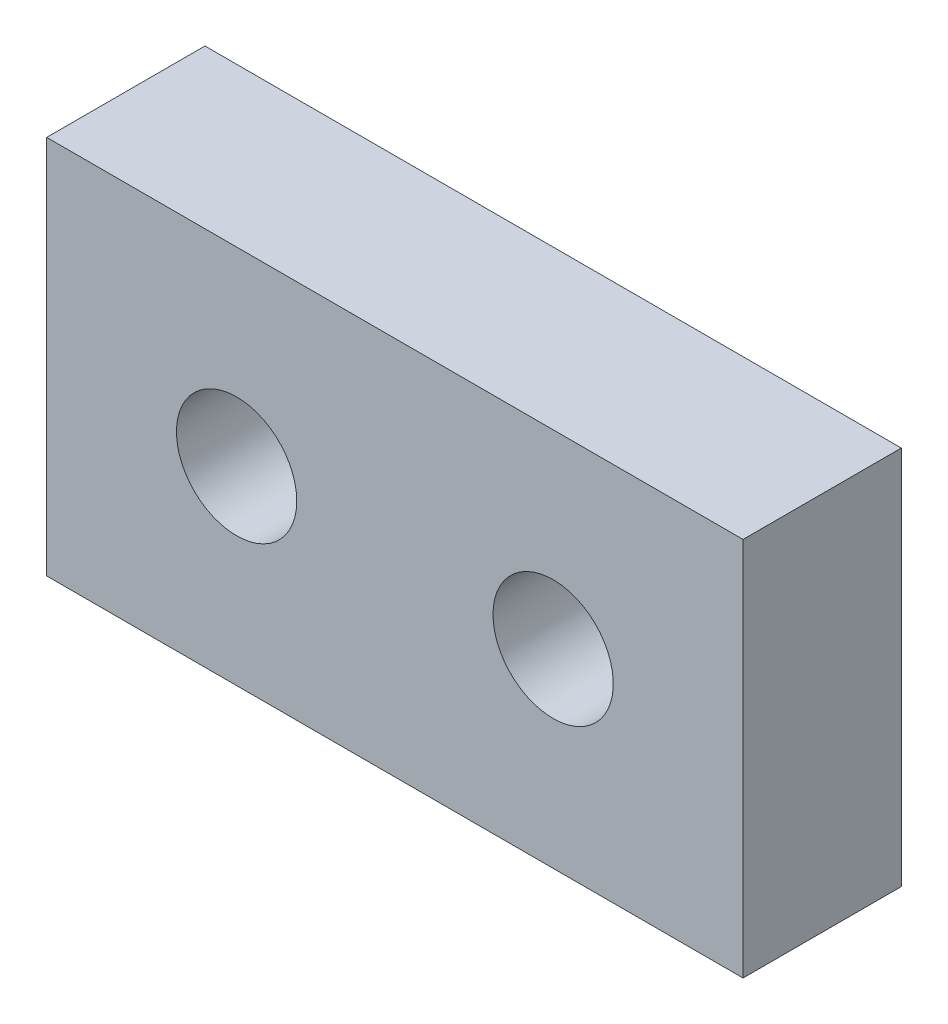
ISO-10303-21;
HEADER;
FILE_DESCRIPTION(('STEP AP214'),'2;1');
FILE_NAME('part.step','',(''),(''),'','','');
FILE_SCHEMA(('AUTOMOTIVE_DESIGN { 1 0 10303 214 1 1 1 1 }'));
ENDSEC;
DATA;
#1=APPLICATION_CONTEXT('core data for automotive mechanical design processes');
#2=APPLICATION_PROTOCOL_DEFINITION('international standard','automotive_design',2000,#1);
#3=PRODUCT_CONTEXT('',#1,'mechanical');
#4=PRODUCT('Part','Part','',(#3));
#5=PRODUCT_RELATED_PRODUCT_CATEGORY('part','',(#4));
#6=PRODUCT_DEFINITION_FORMATION('','',#4);
#7=PRODUCT_DEFINITION_CONTEXT('part definition',#1,'design');
#8=PRODUCT_DEFINITION('design','',#6,#7);
#9=PRODUCT_DEFINITION_SHAPE('','',#8);
#10=(LENGTH_UNIT() NAMED_UNIT(*) SI_UNIT(.MILLI.,.METRE.));
#11=(NAMED_UNIT(*) PLANE_ANGLE_UNIT() SI_UNIT($,.RADIAN.));
#12=(NAMED_UNIT(*) SI_UNIT($,.STERADIAN.) SOLID_ANGLE_UNIT());
#13=UNCERTAINTY_MEASURE_WITH_UNIT(LENGTH_MEASURE(1.E-05),#10,'distance_accuracy_value','');
#14=(GEOMETRIC_REPRESENTATION_CONTEXT(3) GLOBAL_UNCERTAINTY_ASSIGNED_CONTEXT((#13)) GLOBAL_UNIT_ASSIGNED_CONTEXT((#10,
#11,#12)) REPRESENTATION_CONTEXT('',''));
#15=CARTESIAN_POINT('',(0.,0.,0.));
#16=DIRECTION('',(0.,0.,1.));
#17=DIRECTION('',(1.,0.,0.));
#18=AXIS2_PLACEMENT_3D('',#15,#16,#17);
#19=CARTESIAN_POINT('',(0.,0.,5.));
#20=DIRECTION('',(0.,0.,1.));
#21=DIRECTION('',(1.,0.,0.));
#22=AXIS2_PLACEMENT_3D('',#19,#20,#21);
#23=PLANE('',#22);
#24=CARTESIAN_POINT('',(-5.,0.,5.));
#25=DIRECTION('',(0.,0.,1.));
#26=DIRECTION('',(1.,0.,0.));
#27=AXIS2_PLACEMENT_3D('',#24,#25,#26);
#28=CIRCLE('',#27,1.9);
#29=CARTESIAN_POINT('',(-3.1,0.,5.));
#30=VERTEX_POINT('',#29);
#31=EDGE_CURVE('E112',#30,#30,#28,.T.);
#32=ORIENTED_EDGE('',*,*,#31,.F.);
#33=EDGE_LOOP('',(#32));
#34=FACE_BOUND('',#33,.T.);
#35=DIRECTION('',(0.,1.,0.));
#36=VECTOR('',#35,1.);
#37=CARTESIAN_POINT('',(11.,6.,5.));
#38=LINE('',#37,#36);
#39=CARTESIAN_POINT('',(11.,-6.,5.));
#40=VERTEX_POINT('',#39);
#41=CARTESIAN_POINT('',(11.,6.,5.));
#42=VERTEX_POINT('',#41);
#43=EDGE_CURVE('E92',#40,#42,#38,.T.);
#44=ORIENTED_EDGE('',*,*,#43,.T.);
#45=DIRECTION('',(-1.,0.,0.));
#46=VECTOR('',#45,1.);
#47=CARTESIAN_POINT('',(-11.,6.,5.));
#48=LINE('',#47,#46);
#49=CARTESIAN_POINT('',(-11.,6.,5.));
#50=VERTEX_POINT('',#49);
#51=EDGE_CURVE('E87',#42,#50,#48,.T.);
#52=ORIENTED_EDGE('',*,*,#51,.T.);
#53=DIRECTION('',(0.,-1.,0.));
#54=VECTOR('',#53,1.);
#55=CARTESIAN_POINT('',(-11.,6.,5.));
#56=LINE('',#55,#54);
#57=CARTESIAN_POINT('',(-11.,-6.,5.));
#58=VERTEX_POINT('',#57);
#59=EDGE_CURVE('E90',#50,#58,#56,.T.);
#60=ORIENTED_EDGE('',*,*,#59,.T.);
#61=DIRECTION('',(1.,0.,0.));
#62=VECTOR('',#61,1.);
#63=CARTESIAN_POINT('',(-11.,-6.,5.));
#64=LINE('',#63,#62);
#65=EDGE_CURVE('E57',#58,#40,#64,.T.);
#66=ORIENTED_EDGE('',*,*,#65,.T.);
#67=EDGE_LOOP('',(#44,#52,#60,#66));
#68=FACE_BOUND('',#67,.T.);
#69=CARTESIAN_POINT('',(5.,0.,5.));
#70=DIRECTION('',(0.,0.,1.));
#71=DIRECTION('',(-1.,0.,0.));
#72=AXIS2_PLACEMENT_3D('',#69,#70,#71);
#73=CIRCLE('',#72,1.9);
#74=CARTESIAN_POINT('',(3.1,0.,5.));
#75=VERTEX_POINT('',#74);
#76=EDGE_CURVE('E134',#75,#75,#73,.T.);
#77=ORIENTED_EDGE('',*,*,#76,.F.);
#78=EDGE_LOOP('',(#77));
#79=FACE_BOUND('',#78,.T.);
#80=ADVANCED_FACE('F39',(#34,#68,#79),#23,.T.);
#81=CARTESIAN_POINT('',(0.,0.,0.));
#82=DIRECTION('',(0.,0.,1.));
#83=DIRECTION('',(1.,0.,0.));
#84=AXIS2_PLACEMENT_3D('',#81,#82,#83);
#85=PLANE('',#84);
#86=DIRECTION('',(0.,1.,0.));
#87=VECTOR('',#86,1.);
#88=CARTESIAN_POINT('',(11.,6.,0.));
#89=LINE('',#88,#87);
#90=CARTESIAN_POINT('',(11.,-6.,0.));
#91=VERTEX_POINT('',#90);
#92=CARTESIAN_POINT('',(11.,6.,0.));
#93=VERTEX_POINT('',#92);
#94=EDGE_CURVE('E108',#91,#93,#89,.T.);
#95=ORIENTED_EDGE('',*,*,#94,.F.);
#96=DIRECTION('',(1.,0.,0.));
#97=VECTOR('',#96,1.);
#98=CARTESIAN_POINT('',(-11.,-6.,0.));
#99=LINE('',#98,#97);
#100=CARTESIAN_POINT('',(-11.,-6.,0.));
#101=VERTEX_POINT('',#100);
#102=EDGE_CURVE('E80',#101,#91,#99,.T.);
#103=ORIENTED_EDGE('',*,*,#102,.F.);
#104=DIRECTION('',(0.,-1.,0.));
#105=VECTOR('',#104,1.);
#106=CARTESIAN_POINT('',(-11.,6.,0.));
#107=LINE('',#106,#105);
#108=CARTESIAN_POINT('',(-11.,6.,0.));
#109=VERTEX_POINT('',#108);
#110=EDGE_CURVE('E74',#109,#101,#107,.T.);
#111=ORIENTED_EDGE('',*,*,#110,.F.);
#112=DIRECTION('',(-1.,0.,0.));
#113=VECTOR('',#112,1.);
#114=CARTESIAN_POINT('',(-11.,6.,0.));
#115=LINE('',#114,#113);
#116=EDGE_CURVE('E97',#93,#109,#115,.T.);
#117=ORIENTED_EDGE('',*,*,#116,.F.);
#118=EDGE_LOOP('',(#95,#103,#111,#117));
#119=FACE_BOUND('',#118,.T.);
#120=CARTESIAN_POINT('',(-5.,0.,0.));
#121=DIRECTION('',(0.,0.,1.));
#122=DIRECTION('',(1.,0.,0.));
#123=AXIS2_PLACEMENT_3D('',#120,#121,#122);
#124=CIRCLE('',#123,1.9);
#125=CARTESIAN_POINT('',(-3.1,0.,0.));
#126=VERTEX_POINT('',#125);
#127=EDGE_CURVE('E130',#126,#126,#124,.T.);
#128=ORIENTED_EDGE('',*,*,#127,.T.);
#129=EDGE_LOOP('',(#128));
#130=FACE_BOUND('',#129,.T.);
#131=CARTESIAN_POINT('',(5.,0.,0.));
#132=DIRECTION('',(0.,0.,1.));
#133=DIRECTION('',(-1.,0.,0.));
#134=AXIS2_PLACEMENT_3D('',#131,#132,#133);
#135=CIRCLE('',#134,1.9);
#136=CARTESIAN_POINT('',(3.1,0.,0.));
#137=VERTEX_POINT('',#136);
#138=EDGE_CURVE('E138',#137,#137,#135,.T.);
#139=ORIENTED_EDGE('',*,*,#138,.T.);
#140=EDGE_LOOP('',(#139));
#141=FACE_BOUND('',#140,.T.);
#142=ADVANCED_FACE('F125',(#119,#130,#141),#85,.F.);
#143=CARTESIAN_POINT('',(11.,6.,5.));
#144=DIRECTION('',(-1.,0.,0.));
#145=DIRECTION('',(0.,0.,1.));
#146=AXIS2_PLACEMENT_3D('',#143,#144,#145);
#147=PLANE('',#146);
#148=ORIENTED_EDGE('',*,*,#94,.T.);
#149=DIRECTION('',(0.,0.,-1.));
#150=VECTOR('',#149,1.);
#151=CARTESIAN_POINT('',(11.,6.,5.));
#152=LINE('',#151,#150);
#153=EDGE_CURVE('E11',#42,#93,#152,.T.);
#154=ORIENTED_EDGE('',*,*,#153,.F.);
#155=ORIENTED_EDGE('',*,*,#43,.F.);
#156=DIRECTION('',(0.,0.,-1.));
#157=VECTOR('',#156,1.);
#158=CARTESIAN_POINT('',(11.,-6.,5.));
#159=LINE('',#158,#157);
#160=EDGE_CURVE('E104',#40,#91,#159,.T.);
#161=ORIENTED_EDGE('',*,*,#160,.T.);
#162=EDGE_LOOP('',(#148,#154,#155,#161));
#163=FACE_BOUND('',#162,.T.);
#164=ADVANCED_FACE('F41',(#163),#147,.F.);
#165=CARTESIAN_POINT('',(-11.,6.,5.));
#166=DIRECTION('',(0.,-1.,0.));
#167=DIRECTION('',(0.,0.,-1.));
#168=AXIS2_PLACEMENT_3D('',#165,#166,#167);
#169=PLANE('',#168);
#170=ORIENTED_EDGE('',*,*,#116,.T.);
#171=DIRECTION('',(0.,0.,-1.));
#172=VECTOR('',#171,1.);
#173=CARTESIAN_POINT('',(-11.,6.,5.));
#174=LINE('',#173,#172);
#175=EDGE_CURVE('E49',#50,#109,#174,.T.);
#176=ORIENTED_EDGE('',*,*,#175,.F.);
#177=ORIENTED_EDGE('',*,*,#51,.F.);
#178=ORIENTED_EDGE('',*,*,#153,.T.);
#179=EDGE_LOOP('',(#170,#176,#177,#178));
#180=FACE_BOUND('',#179,.T.);
#181=ADVANCED_FACE('F96',(#180),#169,.F.);
#182=CARTESIAN_POINT('',(-11.,6.,5.));
#183=DIRECTION('',(1.,0.,0.));
#184=DIRECTION('',(0.,0.,-1.));
#185=AXIS2_PLACEMENT_3D('',#182,#183,#184);
#186=PLANE('',#185);
#187=ORIENTED_EDGE('',*,*,#110,.T.);
#188=DIRECTION('',(0.,0.,-1.));
#189=VECTOR('',#188,1.);
#190=CARTESIAN_POINT('',(-11.,-6.,5.));
#191=LINE('',#190,#189);
#192=EDGE_CURVE('E99',#58,#101,#191,.T.);
#193=ORIENTED_EDGE('',*,*,#192,.F.);
#194=ORIENTED_EDGE('',*,*,#59,.F.);
#195=ORIENTED_EDGE('',*,*,#175,.T.);
#196=EDGE_LOOP('',(#187,#193,#194,#195));
#197=FACE_BOUND('',#196,.T.);
#198=ADVANCED_FACE('F100',(#197),#186,.F.);
#199=CARTESIAN_POINT('',(-11.,-6.,5.));
#200=DIRECTION('',(0.,1.,0.));
#201=DIRECTION('',(0.,0.,1.));
#202=AXIS2_PLACEMENT_3D('',#199,#200,#201);
#203=PLANE('',#202);
#204=ORIENTED_EDGE('',*,*,#102,.T.);
#205=ORIENTED_EDGE('',*,*,#160,.F.);
#206=ORIENTED_EDGE('',*,*,#65,.F.);
#207=ORIENTED_EDGE('',*,*,#192,.T.);
#208=EDGE_LOOP('',(#204,#205,#206,#207));
#209=FACE_BOUND('',#208,.T.);
#210=ADVANCED_FACE('F122',(#209),#203,.F.);
#211=CARTESIAN_POINT('',(-5.,0.,5.));
#212=DIRECTION('',(0.,0.,-1.));
#213=DIRECTION('',(-1.,0.,0.));
#214=AXIS2_PLACEMENT_3D('',#211,#212,#213);
#215=CYLINDRICAL_SURFACE('',#214,1.9);
#216=ORIENTED_EDGE('',*,*,#31,.T.);
#217=EDGE_LOOP('',(#216));
#218=FACE_BOUND('',#217,.T.);
#219=ORIENTED_EDGE('',*,*,#127,.F.);
#220=EDGE_LOOP('',(#219));
#221=FACE_BOUND('',#220,.T.);
#222=ADVANCED_FACE('F157',(#218,#221),#215,.F.);
#223=CARTESIAN_POINT('',(5.,0.,5.));
#224=DIRECTION('',(0.,0.,-1.));
#225=DIRECTION('',(-1.,0.,0.));
#226=AXIS2_PLACEMENT_3D('',#223,#224,#225);
#227=CYLINDRICAL_SURFACE('',#226,1.9);
#228=ORIENTED_EDGE('',*,*,#76,.T.);
#229=EDGE_LOOP('',(#228));
#230=FACE_BOUND('',#229,.T.);
#231=ORIENTED_EDGE('',*,*,#138,.F.);
#232=EDGE_LOOP('',(#231));
#233=FACE_BOUND('',#232,.T.);
#234=ADVANCED_FACE('F146',(#230,#233),#227,.F.);
#235=CLOSED_SHELL('',(#80,#142,#164,#181,#198,#210,#222,#234));
#236=MANIFOLD_SOLID_BREP('B2',#235);
#237=ADVANCED_BREP_SHAPE_REPRESENTATION('',(#18,#236),#14);
#238=SHAPE_DEFINITION_REPRESENTATION(#9,#237);
ENDSEC;
END-ISO-10303-21;
